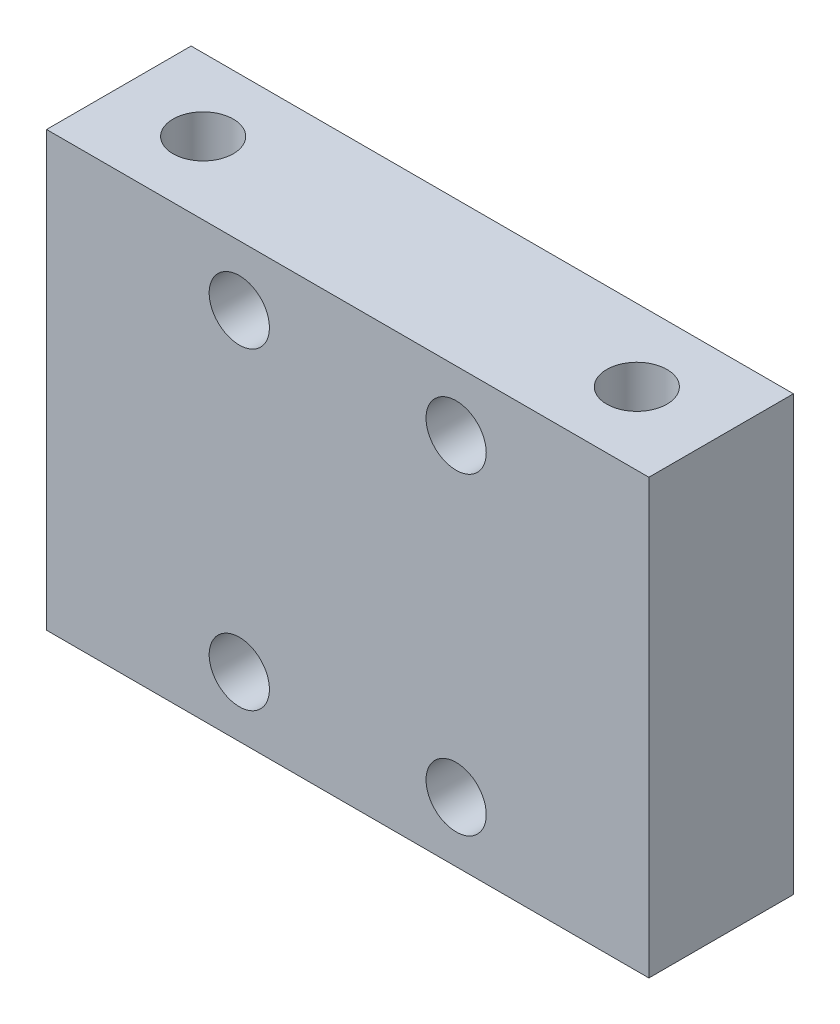
ISO-10303-21;
HEADER;
FILE_DESCRIPTION(('STEP AP214'),'2;1');
FILE_NAME('part.step','',(''),(''),'','','');
FILE_SCHEMA(('AUTOMOTIVE_DESIGN { 1 0 10303 214 1 1 1 1 }'));
ENDSEC;
DATA;
#1=APPLICATION_CONTEXT('core data for automotive mechanical design processes');
#2=APPLICATION_PROTOCOL_DEFINITION('international standard','automotive_design',2000,#1);
#3=PRODUCT_CONTEXT('',#1,'mechanical');
#4=PRODUCT('Part','Part','',(#3));
#5=PRODUCT_RELATED_PRODUCT_CATEGORY('part','',(#4));
#6=PRODUCT_DEFINITION_FORMATION('','',#4);
#7=PRODUCT_DEFINITION_CONTEXT('part definition',#1,'design');
#8=PRODUCT_DEFINITION('design','',#6,#7);
#9=PRODUCT_DEFINITION_SHAPE('','',#8);
#10=(LENGTH_UNIT() NAMED_UNIT(*) SI_UNIT(.MILLI.,.METRE.));
#11=(NAMED_UNIT(*) PLANE_ANGLE_UNIT() SI_UNIT($,.RADIAN.));
#12=(NAMED_UNIT(*) SI_UNIT($,.STERADIAN.) SOLID_ANGLE_UNIT());
#13=UNCERTAINTY_MEASURE_WITH_UNIT(LENGTH_MEASURE(1.E-05),#10,'distance_accuracy_value','');
#14=(GEOMETRIC_REPRESENTATION_CONTEXT(3) GLOBAL_UNCERTAINTY_ASSIGNED_CONTEXT((#13)) GLOBAL_UNIT_ASSIGNED_CONTEXT((#10,
#11,#12)) REPRESENTATION_CONTEXT('',''));
#15=CARTESIAN_POINT('',(0.,0.,0.));
#16=DIRECTION('',(0.,0.,1.));
#17=DIRECTION('',(1.,0.,0.));
#18=AXIS2_PLACEMENT_3D('',#15,#16,#17);
#19=CARTESIAN_POINT('',(12.5,-9.,3.));
#20=DIRECTION('',(-1.,0.,0.));
#21=DIRECTION('',(0.,0.,1.));
#22=AXIS2_PLACEMENT_3D('',#19,#20,#21);
#23=PLANE('',#22);
#24=DIRECTION('',(0.,1.,0.));
#25=VECTOR('',#24,1.);
#26=CARTESIAN_POINT('',(12.5,-9.,-3.));
#27=LINE('',#26,#25);
#28=CARTESIAN_POINT('',(12.5,-9.,-3.));
#29=VERTEX_POINT('',#28);
#30=CARTESIAN_POINT('',(12.5,9.,-3.));
#31=VERTEX_POINT('',#30);
#32=EDGE_CURVE('E107',#29,#31,#27,.T.);
#33=ORIENTED_EDGE('',*,*,#32,.T.);
#34=DIRECTION('',(0.,0.,-1.));
#35=VECTOR('',#34,1.);
#36=CARTESIAN_POINT('',(12.5,9.,3.));
#37=LINE('',#36,#35);
#38=CARTESIAN_POINT('',(12.5,9.,3.));
#39=VERTEX_POINT('',#38);
#40=EDGE_CURVE('E11',#39,#31,#37,.T.);
#41=ORIENTED_EDGE('',*,*,#40,.F.);
#42=DIRECTION('',(0.,1.,0.));
#43=VECTOR('',#42,1.);
#44=CARTESIAN_POINT('',(12.5,-9.,3.));
#45=LINE('',#44,#43);
#46=CARTESIAN_POINT('',(12.5,-9.,3.));
#47=VERTEX_POINT('',#46);
#48=EDGE_CURVE('E94',#47,#39,#45,.T.);
#49=ORIENTED_EDGE('',*,*,#48,.F.);
#50=DIRECTION('',(0.,0.,-1.));
#51=VECTOR('',#50,1.);
#52=CARTESIAN_POINT('',(12.5,-9.,3.));
#53=LINE('',#52,#51);
#54=EDGE_CURVE('E103',#47,#29,#53,.T.);
#55=ORIENTED_EDGE('',*,*,#54,.T.);
#56=EDGE_LOOP('',(#33,#41,#49,#55));
#57=FACE_BOUND('',#56,.T.);
#58=ADVANCED_FACE('F41',(#57),#23,.F.);
#59=CARTESIAN_POINT('',(-12.5,9.,3.));
#60=DIRECTION('',(0.,-1.,0.));
#61=DIRECTION('',(0.,0.,-1.));
#62=AXIS2_PLACEMENT_3D('',#59,#60,#61);
#63=PLANE('',#62);
#64=CARTESIAN_POINT('',(-9.,9.,0.));
#65=DIRECTION('',(0.,1.,0.));
#66=DIRECTION('',(0.,0.,1.));
#67=AXIS2_PLACEMENT_3D('',#64,#65,#66);
#68=CIRCLE('',#67,1.24999999999999);
#69=CARTESIAN_POINT('',(-9.,9.,1.24999999999999));
#70=VERTEX_POINT('',#69);
#71=EDGE_CURVE('E119',#70,#70,#68,.T.);
#72=ORIENTED_EDGE('',*,*,#71,.F.);
#73=EDGE_LOOP('',(#72));
#74=FACE_BOUND('',#73,.T.);
#75=CARTESIAN_POINT('',(9.,9.,0.));
#76=DIRECTION('',(0.,1.,0.));
#77=DIRECTION('',(0.,0.,1.));
#78=AXIS2_PLACEMENT_3D('',#75,#76,#77);
#79=CIRCLE('',#78,1.24999999999999);
#80=CARTESIAN_POINT('',(9.,9.,1.24999999999998));
#81=VERTEX_POINT('',#80);
#82=EDGE_CURVE('E146',#81,#81,#79,.T.);
#83=ORIENTED_EDGE('',*,*,#82,.F.);
#84=EDGE_LOOP('',(#83));
#85=FACE_BOUND('',#84,.T.);
#86=DIRECTION('',(-1.,0.,0.));
#87=VECTOR('',#86,1.);
#88=CARTESIAN_POINT('',(-12.5,9.,-3.));
#89=LINE('',#88,#87);
#90=CARTESIAN_POINT('',(-12.5,9.,-3.));
#91=VERTEX_POINT('',#90);
#92=EDGE_CURVE('E98',#31,#91,#89,.T.);
#93=ORIENTED_EDGE('',*,*,#92,.T.);
#94=DIRECTION('',(0.,0.,-1.));
#95=VECTOR('',#94,1.);
#96=CARTESIAN_POINT('',(-12.5,9.,3.));
#97=LINE('',#96,#95);
#98=CARTESIAN_POINT('',(-12.5,9.,3.));
#99=VERTEX_POINT('',#98);
#100=EDGE_CURVE('E50',#99,#91,#97,.T.);
#101=ORIENTED_EDGE('',*,*,#100,.F.);
#102=DIRECTION('',(-1.,0.,0.));
#103=VECTOR('',#102,1.);
#104=CARTESIAN_POINT('',(-12.5,9.,3.));
#105=LINE('',#104,#103);
#106=EDGE_CURVE('E89',#39,#99,#105,.T.);
#107=ORIENTED_EDGE('',*,*,#106,.F.);
#108=ORIENTED_EDGE('',*,*,#40,.T.);
#109=EDGE_LOOP('',(#93,#101,#107,#108));
#110=FACE_BOUND('',#109,.T.);
#111=ADVANCED_FACE('F97',(#74,#85,#110),#63,.F.);
#112=CARTESIAN_POINT('',(-12.5,-9.,3.));
#113=DIRECTION('',(1.,0.,0.));
#114=DIRECTION('',(0.,0.,-1.));
#115=AXIS2_PLACEMENT_3D('',#112,#113,#114);
#116=PLANE('',#115);
#117=DIRECTION('',(0.,-1.,0.));
#118=VECTOR('',#117,1.);
#119=CARTESIAN_POINT('',(-12.5,-9.,-3.));
#120=LINE('',#119,#118);
#121=CARTESIAN_POINT('',(-12.5,-9.,-3.));
#122=VERTEX_POINT('',#121);
#123=EDGE_CURVE('E76',#91,#122,#120,.T.);
#124=ORIENTED_EDGE('',*,*,#123,.T.);
#125=DIRECTION('',(0.,0.,-1.));
#126=VECTOR('',#125,1.);
#127=CARTESIAN_POINT('',(-12.5,-9.,3.));
#128=LINE('',#127,#126);
#129=CARTESIAN_POINT('',(-12.5,-9.,3.));
#130=VERTEX_POINT('',#129);
#131=EDGE_CURVE('E99',#130,#122,#128,.T.);
#132=ORIENTED_EDGE('',*,*,#131,.F.);
#133=DIRECTION('',(0.,-1.,0.));
#134=VECTOR('',#133,1.);
#135=CARTESIAN_POINT('',(-12.5,-9.,3.));
#136=LINE('',#135,#134);
#137=EDGE_CURVE('E92',#99,#130,#136,.T.);
#138=ORIENTED_EDGE('',*,*,#137,.F.);
#139=ORIENTED_EDGE('',*,*,#100,.T.);
#140=EDGE_LOOP('',(#124,#132,#138,#139));
#141=FACE_BOUND('',#140,.T.);
#142=ADVANCED_FACE('F101',(#141),#116,.F.);
#143=CARTESIAN_POINT('',(-12.5,-9.,3.));
#144=DIRECTION('',(0.,1.,0.));
#145=DIRECTION('',(0.,0.,1.));
#146=AXIS2_PLACEMENT_3D('',#143,#144,#145);
#147=PLANE('',#146);
#148=CARTESIAN_POINT('',(-9.,-9.,0.));
#149=DIRECTION('',(0.,1.,0.));
#150=DIRECTION('',(0.,0.,1.));
#151=AXIS2_PLACEMENT_3D('',#148,#149,#150);
#152=CIRCLE('',#151,1.25);
#153=CARTESIAN_POINT('',(-9.,-9.,1.25));
#154=VERTEX_POINT('',#153);
#155=EDGE_CURVE('E143',#154,#154,#152,.T.);
#156=ORIENTED_EDGE('',*,*,#155,.T.);
#157=EDGE_LOOP('',(#156));
#158=FACE_BOUND('',#157,.T.);
#159=CARTESIAN_POINT('',(9.,-9.,0.));
#160=DIRECTION('',(0.,1.,0.));
#161=DIRECTION('',(0.,0.,1.));
#162=AXIS2_PLACEMENT_3D('',#159,#160,#161);
#163=CIRCLE('',#162,1.25);
#164=CARTESIAN_POINT('',(9.,-9.,1.24999999999999));
#165=VERTEX_POINT('',#164);
#166=EDGE_CURVE('E110',#165,#165,#163,.T.);
#167=ORIENTED_EDGE('',*,*,#166,.T.);
#168=EDGE_LOOP('',(#167));
#169=FACE_BOUND('',#168,.T.);
#170=DIRECTION('',(1.,0.,0.));
#171=VECTOR('',#170,1.);
#172=CARTESIAN_POINT('',(-12.5,-9.,-3.));
#173=LINE('',#172,#171);
#174=EDGE_CURVE('E82',#122,#29,#173,.T.);
#175=ORIENTED_EDGE('',*,*,#174,.T.);
#176=ORIENTED_EDGE('',*,*,#54,.F.);
#177=DIRECTION('',(1.,0.,0.));
#178=VECTOR('',#177,1.);
#179=CARTESIAN_POINT('',(-12.5,-9.,3.));
#180=LINE('',#179,#178);
#181=EDGE_CURVE('E59',#130,#47,#180,.T.);
#182=ORIENTED_EDGE('',*,*,#181,.F.);
#183=ORIENTED_EDGE('',*,*,#131,.T.);
#184=EDGE_LOOP('',(#175,#176,#182,#183));
#185=FACE_BOUND('',#184,.T.);
#186=ADVANCED_FACE('F152',(#158,#169,#185),#147,.F.);
#187=CARTESIAN_POINT('',(0.,0.,3.));
#188=DIRECTION('',(0.,0.,-1.));
#189=DIRECTION('',(-1.,0.,0.));
#190=AXIS2_PLACEMENT_3D('',#187,#188,#189);
#191=PLANE('',#190);
#192=CARTESIAN_POINT('',(-4.5,-6.5,3.));
#193=DIRECTION('',(0.,0.,1.));
#194=DIRECTION('',(1.,0.,0.));
#195=AXIS2_PLACEMENT_3D('',#192,#193,#194);
#196=CIRCLE('',#195,1.24999999999999);
#197=CARTESIAN_POINT('',(-3.25000000000001,-6.5,3.));
#198=VERTEX_POINT('',#197);
#199=EDGE_CURVE('E136',#198,#198,#196,.T.);
#200=ORIENTED_EDGE('',*,*,#199,.F.);
#201=EDGE_LOOP('',(#200));
#202=FACE_BOUND('',#201,.T.);
#203=CARTESIAN_POINT('',(4.5,-6.5,3.));
#204=DIRECTION('',(0.,0.,1.));
#205=DIRECTION('',(1.,0.,0.));
#206=AXIS2_PLACEMENT_3D('',#203,#204,#205);
#207=CIRCLE('',#206,1.24999999999999);
#208=CARTESIAN_POINT('',(5.74999999999999,-6.5,3.));
#209=VERTEX_POINT('',#208);
#210=EDGE_CURVE('E126',#209,#209,#207,.T.);
#211=ORIENTED_EDGE('',*,*,#210,.F.);
#212=EDGE_LOOP('',(#211));
#213=FACE_BOUND('',#212,.T.);
#214=CARTESIAN_POINT('',(4.5,6.5,3.));
#215=DIRECTION('',(0.,0.,1.));
#216=DIRECTION('',(1.,0.,0.));
#217=AXIS2_PLACEMENT_3D('',#214,#215,#216);
#218=CIRCLE('',#217,1.24999999999999);
#219=CARTESIAN_POINT('',(5.74999999999999,6.5,3.));
#220=VERTEX_POINT('',#219);
#221=EDGE_CURVE('E123',#220,#220,#218,.T.);
#222=ORIENTED_EDGE('',*,*,#221,.F.);
#223=EDGE_LOOP('',(#222));
#224=FACE_BOUND('',#223,.T.);
#225=CARTESIAN_POINT('',(-4.5,6.5,3.));
#226=DIRECTION('',(0.,0.,1.));
#227=DIRECTION('',(1.,0.,0.));
#228=AXIS2_PLACEMENT_3D('',#225,#226,#227);
#229=CIRCLE('',#228,1.24999999999999);
#230=CARTESIAN_POINT('',(-3.25000000000001,6.5,3.));
#231=VERTEX_POINT('',#230);
#232=EDGE_CURVE('E120',#231,#231,#229,.T.);
#233=ORIENTED_EDGE('',*,*,#232,.F.);
#234=EDGE_LOOP('',(#233));
#235=FACE_BOUND('',#234,.T.);
#236=ORIENTED_EDGE('',*,*,#48,.T.);
#237=ORIENTED_EDGE('',*,*,#106,.T.);
#238=ORIENTED_EDGE('',*,*,#137,.T.);
#239=ORIENTED_EDGE('',*,*,#181,.T.);
#240=EDGE_LOOP('',(#236,#237,#238,#239));
#241=FACE_BOUND('',#240,.T.);
#242=ADVANCED_FACE('F90',(#202,#213,#224,#235,#241),#191,.F.);
#243=CARTESIAN_POINT('',(0.,0.,-3.));
#244=DIRECTION('',(0.,0.,-1.));
#245=DIRECTION('',(-1.,0.,0.));
#246=AXIS2_PLACEMENT_3D('',#243,#244,#245);
#247=PLANE('',#246);
#248=CARTESIAN_POINT('',(-4.5,-6.5,-3.));
#249=DIRECTION('',(0.,0.,-1.));
#250=DIRECTION('',(-1.,0.,0.));
#251=AXIS2_PLACEMENT_3D('',#248,#249,#250);
#252=CIRCLE('',#251,1.24999999999999);
#253=CARTESIAN_POINT('',(-5.74999999999999,-6.5,-3.));
#254=VERTEX_POINT('',#253);
#255=EDGE_CURVE('E44',#254,#254,#252,.T.);
#256=ORIENTED_EDGE('',*,*,#255,.F.);
#257=EDGE_LOOP('',(#256));
#258=FACE_BOUND('',#257,.T.);
#259=CARTESIAN_POINT('',(4.5,-6.5,-3.));
#260=DIRECTION('',(0.,0.,-1.));
#261=DIRECTION('',(-1.,0.,0.));
#262=AXIS2_PLACEMENT_3D('',#259,#260,#261);
#263=CIRCLE('',#262,1.24999999999999);
#264=CARTESIAN_POINT('',(3.25000000000001,-6.5,-3.));
#265=VERTEX_POINT('',#264);
#266=EDGE_CURVE('E124',#265,#265,#263,.T.);
#267=ORIENTED_EDGE('',*,*,#266,.F.);
#268=EDGE_LOOP('',(#267));
#269=FACE_BOUND('',#268,.T.);
#270=CARTESIAN_POINT('',(4.5,6.5,-3.));
#271=DIRECTION('',(0.,0.,-1.));
#272=DIRECTION('',(-1.,0.,0.));
#273=AXIS2_PLACEMENT_3D('',#270,#271,#272);
#274=CIRCLE('',#273,1.24999999999999);
#275=CARTESIAN_POINT('',(3.25000000000001,6.5,-3.));
#276=VERTEX_POINT('',#275);
#277=EDGE_CURVE('E121',#276,#276,#274,.T.);
#278=ORIENTED_EDGE('',*,*,#277,.F.);
#279=EDGE_LOOP('',(#278));
#280=FACE_BOUND('',#279,.T.);
#281=CARTESIAN_POINT('',(-4.5,6.5,-3.));
#282=DIRECTION('',(0.,0.,-1.));
#283=DIRECTION('',(-1.,0.,0.));
#284=AXIS2_PLACEMENT_3D('',#281,#282,#283);
#285=CIRCLE('',#284,1.24999999999999);
#286=CARTESIAN_POINT('',(-5.74999999999999,6.5,-3.));
#287=VERTEX_POINT('',#286);
#288=EDGE_CURVE('E116',#287,#287,#285,.T.);
#289=ORIENTED_EDGE('',*,*,#288,.F.);
#290=EDGE_LOOP('',(#289));
#291=FACE_BOUND('',#290,.T.);
#292=ORIENTED_EDGE('',*,*,#32,.F.);
#293=ORIENTED_EDGE('',*,*,#174,.F.);
#294=ORIENTED_EDGE('',*,*,#123,.F.);
#295=ORIENTED_EDGE('',*,*,#92,.F.);
#296=EDGE_LOOP('',(#292,#293,#294,#295));
#297=FACE_BOUND('',#296,.T.);
#298=ADVANCED_FACE('F158',(#258,#269,#280,#291,#297),#247,.T.);
#299=CARTESIAN_POINT('',(9.,9.,0.));
#300=DIRECTION('',(0.,1.,0.));
#301=DIRECTION('',(0.,0.,1.));
#302=AXIS2_PLACEMENT_3D('',#299,#300,#301);
#303=CYLINDRICAL_SURFACE('',#302,1.24999999999999);
#304=ORIENTED_EDGE('',*,*,#166,.F.);
#305=EDGE_LOOP('',(#304));
#306=FACE_BOUND('',#305,.T.);
#307=ORIENTED_EDGE('',*,*,#82,.T.);
#308=EDGE_LOOP('',(#307));
#309=FACE_BOUND('',#308,.T.);
#310=ADVANCED_FACE('F154',(#306,#309),#303,.F.);
#311=CARTESIAN_POINT('',(-9.,9.,0.));
#312=DIRECTION('',(0.,1.,0.));
#313=DIRECTION('',(0.,0.,1.));
#314=AXIS2_PLACEMENT_3D('',#311,#312,#313);
#315=CYLINDRICAL_SURFACE('',#314,1.24999999999999);
#316=ORIENTED_EDGE('',*,*,#155,.F.);
#317=EDGE_LOOP('',(#316));
#318=FACE_BOUND('',#317,.T.);
#319=ORIENTED_EDGE('',*,*,#71,.T.);
#320=EDGE_LOOP('',(#319));
#321=FACE_BOUND('',#320,.T.);
#322=ADVANCED_FACE('F157',(#318,#321),#315,.F.);
#323=CARTESIAN_POINT('',(-4.5,6.5,3.));
#324=DIRECTION('',(0.,0.,1.));
#325=DIRECTION('',(1.,0.,0.));
#326=AXIS2_PLACEMENT_3D('',#323,#324,#325);
#327=CYLINDRICAL_SURFACE('',#326,1.24999999999999);
#328=ORIENTED_EDGE('',*,*,#288,.T.);
#329=EDGE_LOOP('',(#328));
#330=FACE_BOUND('',#329,.T.);
#331=ORIENTED_EDGE('',*,*,#232,.T.);
#332=EDGE_LOOP('',(#331));
#333=FACE_BOUND('',#332,.T.);
#334=ADVANCED_FACE('F183',(#330,#333),#327,.F.);
#335=CARTESIAN_POINT('',(4.5,6.5,3.));
#336=DIRECTION('',(0.,0.,1.));
#337=DIRECTION('',(1.,0.,0.));
#338=AXIS2_PLACEMENT_3D('',#335,#336,#337);
#339=CYLINDRICAL_SURFACE('',#338,1.24999999999999);
#340=ORIENTED_EDGE('',*,*,#277,.T.);
#341=EDGE_LOOP('',(#340));
#342=FACE_BOUND('',#341,.T.);
#343=ORIENTED_EDGE('',*,*,#221,.T.);
#344=EDGE_LOOP('',(#343));
#345=FACE_BOUND('',#344,.T.);
#346=ADVANCED_FACE('F187',(#342,#345),#339,.F.);
#347=CARTESIAN_POINT('',(4.5,-6.5,3.));
#348=DIRECTION('',(0.,0.,1.));
#349=DIRECTION('',(1.,0.,0.));
#350=AXIS2_PLACEMENT_3D('',#347,#348,#349);
#351=CYLINDRICAL_SURFACE('',#350,1.24999999999999);
#352=ORIENTED_EDGE('',*,*,#266,.T.);
#353=EDGE_LOOP('',(#352));
#354=FACE_BOUND('',#353,.T.);
#355=ORIENTED_EDGE('',*,*,#210,.T.);
#356=EDGE_LOOP('',(#355));
#357=FACE_BOUND('',#356,.T.);
#358=ADVANCED_FACE('F191',(#354,#357),#351,.F.);
#359=CARTESIAN_POINT('',(-4.5,-6.5,3.));
#360=DIRECTION('',(0.,0.,1.));
#361=DIRECTION('',(1.,0.,0.));
#362=AXIS2_PLACEMENT_3D('',#359,#360,#361);
#363=CYLINDRICAL_SURFACE('',#362,1.24999999999999);
#364=ORIENTED_EDGE('',*,*,#255,.T.);
#365=EDGE_LOOP('',(#364));
#366=FACE_BOUND('',#365,.T.);
#367=ORIENTED_EDGE('',*,*,#199,.T.);
#368=EDGE_LOOP('',(#367));
#369=FACE_BOUND('',#368,.T.);
#370=ADVANCED_FACE('F195',(#366,#369),#363,.F.);
#371=CLOSED_SHELL('',(#58,#111,#142,#186,#242,#298,#310,#322,#334,#346,#358,#370));
#372=MANIFOLD_SOLID_BREP('B2',#371);
#373=ADVANCED_BREP_SHAPE_REPRESENTATION('',(#18,#372),#14);
#374=SHAPE_DEFINITION_REPRESENTATION(#9,#373);
ENDSEC;
END-ISO-10303-21;
